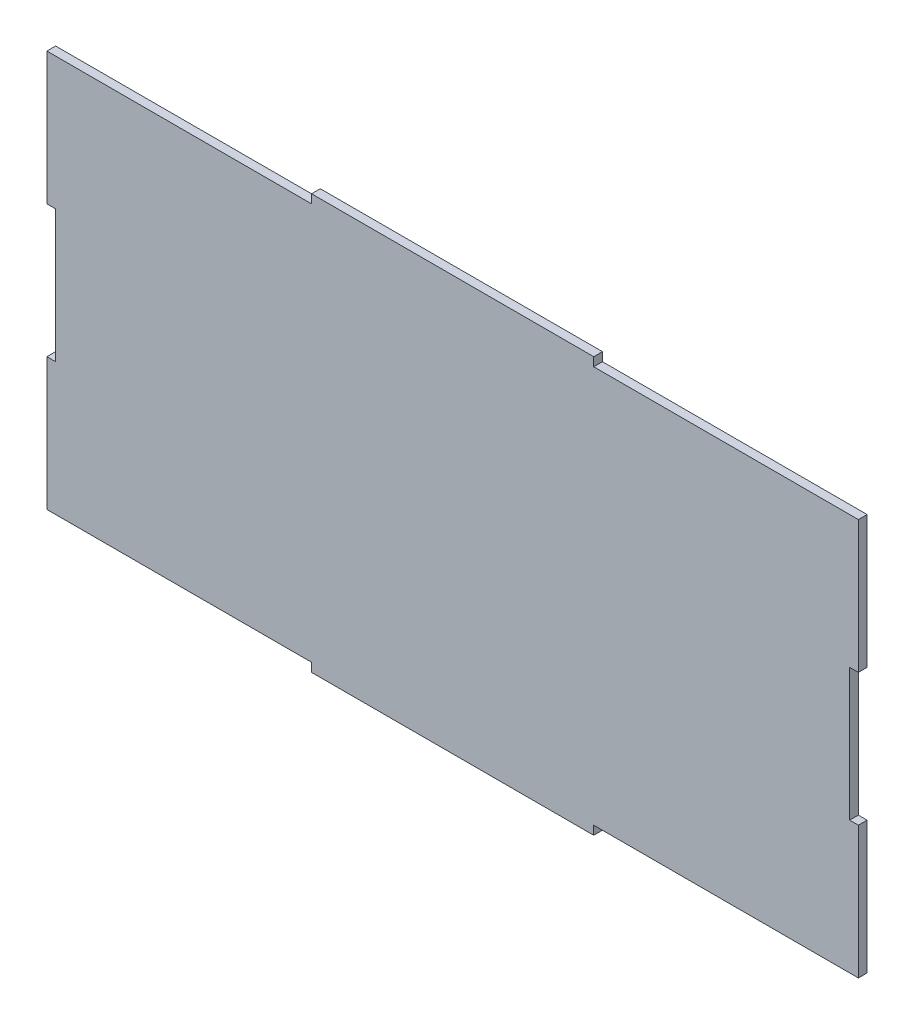
ISO-10303-21;
HEADER;
FILE_DESCRIPTION(('STEP AP214'),'2;1');
FILE_NAME('part.step','',(''),(''),'','','');
FILE_SCHEMA(('AUTOMOTIVE_DESIGN { 1 0 10303 214 1 1 1 1 }'));
ENDSEC;
DATA;
#1=APPLICATION_CONTEXT('core data for automotive mechanical design processes');
#2=APPLICATION_PROTOCOL_DEFINITION('international standard','automotive_design',2000,#1);
#3=PRODUCT_CONTEXT('',#1,'mechanical');
#4=PRODUCT('Part','Part','',(#3));
#5=PRODUCT_RELATED_PRODUCT_CATEGORY('part','',(#4));
#6=PRODUCT_DEFINITION_FORMATION('','',#4);
#7=PRODUCT_DEFINITION_CONTEXT('part definition',#1,'design');
#8=PRODUCT_DEFINITION('design','',#6,#7);
#9=PRODUCT_DEFINITION_SHAPE('','',#8);
#10=(LENGTH_UNIT() NAMED_UNIT(*) SI_UNIT(.MILLI.,.METRE.));
#11=(NAMED_UNIT(*) PLANE_ANGLE_UNIT() SI_UNIT($,.RADIAN.));
#12=(NAMED_UNIT(*) SI_UNIT($,.STERADIAN.) SOLID_ANGLE_UNIT());
#13=UNCERTAINTY_MEASURE_WITH_UNIT(LENGTH_MEASURE(1.E-05),#10,'distance_accuracy_value','');
#14=(GEOMETRIC_REPRESENTATION_CONTEXT(3) GLOBAL_UNCERTAINTY_ASSIGNED_CONTEXT((#13)) GLOBAL_UNIT_ASSIGNED_CONTEXT((#10,
#11,#12)) REPRESENTATION_CONTEXT('',''));
#15=CARTESIAN_POINT('',(0.,0.,0.));
#16=DIRECTION('',(0.,0.,1.));
#17=DIRECTION('',(1.,0.,0.));
#18=AXIS2_PLACEMENT_3D('',#15,#16,#17);
#19=CARTESIAN_POINT('',(-153.3,75.,3.3));
#20=DIRECTION('',(1.,0.,0.));
#21=DIRECTION('',(0.,0.,-1.));
#22=AXIS2_PLACEMENT_3D('',#19,#20,#21);
#23=PLANE('',#22);
#24=DIRECTION('',(0.,-1.,0.));
#25=VECTOR('',#24,1.);
#26=CARTESIAN_POINT('',(-153.3,75.,0.));
#27=LINE('',#26,#25);
#28=CARTESIAN_POINT('',(-153.3,75.,0.));
#29=VERTEX_POINT('',#28);
#30=CARTESIAN_POINT('',(-153.3,25.,0.));
#31=VERTEX_POINT('',#30);
#32=EDGE_CURVE('E212',#29,#31,#27,.T.);
#33=ORIENTED_EDGE('',*,*,#32,.T.);
#34=DIRECTION('',(0.,0.,-1.));
#35=VECTOR('',#34,1.);
#36=CARTESIAN_POINT('',(-153.3,25.,3.3));
#37=LINE('',#36,#35);
#38=CARTESIAN_POINT('',(-153.3,25.,3.3));
#39=VERTEX_POINT('',#38);
#40=EDGE_CURVE('E11',#39,#31,#37,.T.);
#41=ORIENTED_EDGE('',*,*,#40,.F.);
#42=DIRECTION('',(0.,-1.,0.));
#43=VECTOR('',#42,1.);
#44=CARTESIAN_POINT('',(-153.3,75.,3.3));
#45=LINE('',#44,#43);
#46=CARTESIAN_POINT('',(-153.3,75.,3.3));
#47=VERTEX_POINT('',#46);
#48=EDGE_CURVE('E270',#47,#39,#45,.T.);
#49=ORIENTED_EDGE('',*,*,#48,.F.);
#50=DIRECTION('',(0.,0.,-1.));
#51=VECTOR('',#50,1.);
#52=CARTESIAN_POINT('',(-153.3,75.,3.3));
#53=LINE('',#52,#51);
#54=EDGE_CURVE('E208',#47,#29,#53,.T.);
#55=ORIENTED_EDGE('',*,*,#54,.T.);
#56=EDGE_LOOP('',(#33,#41,#49,#55));
#57=FACE_BOUND('',#56,.T.);
#58=ADVANCED_FACE('F39',(#57),#23,.F.);
#59=CARTESIAN_POINT('',(-153.3,25.,3.3));
#60=DIRECTION('',(0.,1.,0.));
#61=DIRECTION('',(-1.,0.,0.));
#62=AXIS2_PLACEMENT_3D('',#59,#60,#61);
#63=PLANE('',#62);
#64=DIRECTION('',(1.,0.,0.));
#65=VECTOR('',#64,1.);
#66=CARTESIAN_POINT('',(-153.3,25.,0.));
#67=LINE('',#66,#65);
#68=CARTESIAN_POINT('',(-150.,25.,0.));
#69=VERTEX_POINT('',#68);
#70=EDGE_CURVE('E216',#31,#69,#67,.T.);
#71=ORIENTED_EDGE('',*,*,#70,.T.);
#72=DIRECTION('',(0.,0.,-1.));
#73=VECTOR('',#72,1.);
#74=CARTESIAN_POINT('',(-150.,25.,3.3));
#75=LINE('',#74,#73);
#76=CARTESIAN_POINT('',(-150.,25.,3.3));
#77=VERTEX_POINT('',#76);
#78=EDGE_CURVE('E48',#77,#69,#75,.T.);
#79=ORIENTED_EDGE('',*,*,#78,.F.);
#80=DIRECTION('',(1.,0.,0.));
#81=VECTOR('',#80,1.);
#82=CARTESIAN_POINT('',(-153.3,25.,3.3));
#83=LINE('',#82,#81);
#84=EDGE_CURVE('E135',#39,#77,#83,.T.);
#85=ORIENTED_EDGE('',*,*,#84,.F.);
#86=ORIENTED_EDGE('',*,*,#40,.T.);
#87=EDGE_LOOP('',(#71,#79,#85,#86));
#88=FACE_BOUND('',#87,.T.);
#89=ADVANCED_FACE('F420',(#88),#63,.F.);
#90=CARTESIAN_POINT('',(-150.,-25.,3.3));
#91=DIRECTION('',(1.,0.,0.));
#92=DIRECTION('',(0.,1.,0.));
#93=AXIS2_PLACEMENT_3D('',#90,#91,#92);
#94=PLANE('',#93);
#95=DIRECTION('',(0.,-1.,0.));
#96=VECTOR('',#95,1.);
#97=CARTESIAN_POINT('',(-150.,-25.,0.));
#98=LINE('',#97,#96);
#99=CARTESIAN_POINT('',(-150.,-25.,0.));
#100=VERTEX_POINT('',#99);
#101=EDGE_CURVE('E219',#69,#100,#98,.T.);
#102=ORIENTED_EDGE('',*,*,#101,.T.);
#103=DIRECTION('',(0.,0.,-1.));
#104=VECTOR('',#103,1.);
#105=CARTESIAN_POINT('',(-150.,-25.,3.3));
#106=LINE('',#105,#104);
#107=CARTESIAN_POINT('',(-150.,-25.,3.3));
#108=VERTEX_POINT('',#107);
#109=EDGE_CURVE('E329',#108,#100,#106,.T.);
#110=ORIENTED_EDGE('',*,*,#109,.F.);
#111=DIRECTION('',(0.,-1.,0.));
#112=VECTOR('',#111,1.);
#113=CARTESIAN_POINT('',(-150.,-25.,3.3));
#114=LINE('',#113,#112);
#115=EDGE_CURVE('E339',#77,#108,#114,.T.);
#116=ORIENTED_EDGE('',*,*,#115,.F.);
#117=ORIENTED_EDGE('',*,*,#78,.T.);
#118=EDGE_LOOP('',(#102,#110,#116,#117));
#119=FACE_BOUND('',#118,.T.);
#120=ADVANCED_FACE('F337',(#119),#94,.F.);
#121=CARTESIAN_POINT('',(-153.3,-25.,3.3));
#122=DIRECTION('',(0.,-1.,0.));
#123=DIRECTION('',(0.,0.,-1.));
#124=AXIS2_PLACEMENT_3D('',#121,#122,#123);
#125=PLANE('',#124);
#126=DIRECTION('',(-1.,0.,0.));
#127=VECTOR('',#126,1.);
#128=CARTESIAN_POINT('',(-153.3,-25.,0.));
#129=LINE('',#128,#127);
#130=CARTESIAN_POINT('',(-153.3,-25.,0.));
#131=VERTEX_POINT('',#130);
#132=EDGE_CURVE('E222',#100,#131,#129,.T.);
#133=ORIENTED_EDGE('',*,*,#132,.T.);
#134=DIRECTION('',(0.,0.,-1.));
#135=VECTOR('',#134,1.);
#136=CARTESIAN_POINT('',(-153.3,-25.,3.3));
#137=LINE('',#136,#135);
#138=CARTESIAN_POINT('',(-153.3,-25.,3.3));
#139=VERTEX_POINT('',#138);
#140=EDGE_CURVE('E325',#139,#131,#137,.T.);
#141=ORIENTED_EDGE('',*,*,#140,.F.);
#142=DIRECTION('',(-1.,0.,0.));
#143=VECTOR('',#142,1.);
#144=CARTESIAN_POINT('',(-153.3,-25.,3.3));
#145=LINE('',#144,#143);
#146=EDGE_CURVE('E358',#108,#139,#145,.T.);
#147=ORIENTED_EDGE('',*,*,#146,.F.);
#148=ORIENTED_EDGE('',*,*,#109,.T.);
#149=EDGE_LOOP('',(#133,#141,#147,#148));
#150=FACE_BOUND('',#149,.T.);
#151=ADVANCED_FACE('F348',(#150),#125,.F.);
#152=CARTESIAN_POINT('',(-153.3,-25.,3.3));
#153=DIRECTION('',(1.,0.,0.));
#154=DIRECTION('',(0.,0.,-1.));
#155=AXIS2_PLACEMENT_3D('',#152,#153,#154);
#156=PLANE('',#155);
#157=DIRECTION('',(0.,-1.,0.));
#158=VECTOR('',#157,1.);
#159=CARTESIAN_POINT('',(-153.3,-25.,0.));
#160=LINE('',#159,#158);
#161=CARTESIAN_POINT('',(-153.3,-75.,0.));
#162=VERTEX_POINT('',#161);
#163=EDGE_CURVE('E225',#131,#162,#160,.T.);
#164=ORIENTED_EDGE('',*,*,#163,.T.);
#165=DIRECTION('',(0.,0.,-1.));
#166=VECTOR('',#165,1.);
#167=CARTESIAN_POINT('',(-153.3,-75.,3.3));
#168=LINE('',#167,#166);
#169=CARTESIAN_POINT('',(-153.3,-75.,3.3));
#170=VERTEX_POINT('',#169);
#171=EDGE_CURVE('E321',#170,#162,#168,.T.);
#172=ORIENTED_EDGE('',*,*,#171,.F.);
#173=DIRECTION('',(0.,-1.,0.));
#174=VECTOR('',#173,1.);
#175=CARTESIAN_POINT('',(-153.3,-25.,3.3));
#176=LINE('',#175,#174);
#177=EDGE_CURVE('E354',#139,#170,#176,.T.);
#178=ORIENTED_EDGE('',*,*,#177,.F.);
#179=ORIENTED_EDGE('',*,*,#140,.T.);
#180=EDGE_LOOP('',(#164,#172,#178,#179));
#181=FACE_BOUND('',#180,.T.);
#182=ADVANCED_FACE('F352',(#181),#156,.F.);
#183=CARTESIAN_POINT('',(-153.3,-75.,3.3));
#184=DIRECTION('',(0.,1.,0.));
#185=DIRECTION('',(-1.,0.,0.));
#186=AXIS2_PLACEMENT_3D('',#183,#184,#185);
#187=PLANE('',#186);
#188=DIRECTION('',(1.,0.,0.));
#189=VECTOR('',#188,1.);
#190=CARTESIAN_POINT('',(-153.3,-75.,0.));
#191=LINE('',#190,#189);
#192=CARTESIAN_POINT('',(-53.3,-75.,0.));
#193=VERTEX_POINT('',#192);
#194=EDGE_CURVE('E228',#162,#193,#191,.T.);
#195=ORIENTED_EDGE('',*,*,#194,.T.);
#196=DIRECTION('',(0.,0.,-1.));
#197=VECTOR('',#196,1.);
#198=CARTESIAN_POINT('',(-53.3,-75.,3.3));
#199=LINE('',#198,#197);
#200=CARTESIAN_POINT('',(-53.3,-75.,3.3));
#201=VERTEX_POINT('',#200);
#202=EDGE_CURVE('E317',#201,#193,#199,.T.);
#203=ORIENTED_EDGE('',*,*,#202,.F.);
#204=DIRECTION('',(1.,0.,0.));
#205=VECTOR('',#204,1.);
#206=CARTESIAN_POINT('',(-153.3,-75.,3.3));
#207=LINE('',#206,#205);
#208=EDGE_CURVE('E357',#170,#201,#207,.T.);
#209=ORIENTED_EDGE('',*,*,#208,.F.);
#210=ORIENTED_EDGE('',*,*,#171,.T.);
#211=EDGE_LOOP('',(#195,#203,#209,#210));
#212=FACE_BOUND('',#211,.T.);
#213=ADVANCED_FACE('F433',(#212),#187,.F.);
#214=CARTESIAN_POINT('',(-53.3,-75.,3.3));
#215=DIRECTION('',(1.,0.,0.));
#216=DIRECTION('',(0.,1.,0.));
#217=AXIS2_PLACEMENT_3D('',#214,#215,#216);
#218=PLANE('',#217);
#219=DIRECTION('',(0.,-1.,0.));
#220=VECTOR('',#219,1.);
#221=CARTESIAN_POINT('',(-53.3,-75.,0.));
#222=LINE('',#221,#220);
#223=CARTESIAN_POINT('',(-53.3,-78.3,0.));
#224=VERTEX_POINT('',#223);
#225=EDGE_CURVE('E231',#193,#224,#222,.T.);
#226=ORIENTED_EDGE('',*,*,#225,.T.);
#227=DIRECTION('',(0.,0.,-1.));
#228=VECTOR('',#227,1.);
#229=CARTESIAN_POINT('',(-53.3,-78.3,3.3));
#230=LINE('',#229,#228);
#231=CARTESIAN_POINT('',(-53.3,-78.3,3.3));
#232=VERTEX_POINT('',#231);
#233=EDGE_CURVE('E313',#232,#224,#230,.T.);
#234=ORIENTED_EDGE('',*,*,#233,.F.);
#235=DIRECTION('',(0.,-1.,0.));
#236=VECTOR('',#235,1.);
#237=CARTESIAN_POINT('',(-53.3,-75.,3.3));
#238=LINE('',#237,#236);
#239=EDGE_CURVE('E362',#201,#232,#238,.T.);
#240=ORIENTED_EDGE('',*,*,#239,.F.);
#241=ORIENTED_EDGE('',*,*,#202,.T.);
#242=EDGE_LOOP('',(#226,#234,#240,#241));
#243=FACE_BOUND('',#242,.T.);
#244=ADVANCED_FACE('F436',(#243),#218,.F.);
#245=CARTESIAN_POINT('',(53.3,-78.3,3.3));
#246=DIRECTION('',(0.,1.,0.));
#247=DIRECTION('',(-1.,0.,0.));
#248=AXIS2_PLACEMENT_3D('',#245,#246,#247);
#249=PLANE('',#248);
#250=DIRECTION('',(1.,0.,0.));
#251=VECTOR('',#250,1.);
#252=CARTESIAN_POINT('',(53.3,-78.3,0.));
#253=LINE('',#252,#251);
#254=CARTESIAN_POINT('',(53.3,-78.3,0.));
#255=VERTEX_POINT('',#254);
#256=EDGE_CURVE('E234',#224,#255,#253,.T.);
#257=ORIENTED_EDGE('',*,*,#256,.T.);
#258=DIRECTION('',(0.,0.,-1.));
#259=VECTOR('',#258,1.);
#260=CARTESIAN_POINT('',(53.3,-78.3,3.3));
#261=LINE('',#260,#259);
#262=CARTESIAN_POINT('',(53.3,-78.3,3.3));
#263=VERTEX_POINT('',#262);
#264=EDGE_CURVE('E309',#263,#255,#261,.T.);
#265=ORIENTED_EDGE('',*,*,#264,.F.);
#266=DIRECTION('',(1.,0.,0.));
#267=VECTOR('',#266,1.);
#268=CARTESIAN_POINT('',(53.3,-78.3,3.3));
#269=LINE('',#268,#267);
#270=EDGE_CURVE('E369',#232,#263,#269,.T.);
#271=ORIENTED_EDGE('',*,*,#270,.F.);
#272=ORIENTED_EDGE('',*,*,#233,.T.);
#273=EDGE_LOOP('',(#257,#265,#271,#272));
#274=FACE_BOUND('',#273,.T.);
#275=ADVANCED_FACE('F440',(#274),#249,.F.);
#276=CARTESIAN_POINT('',(53.3,-75.,3.3));
#277=DIRECTION('',(-1.,0.,0.));
#278=DIRECTION('',(0.,-1.,0.));
#279=AXIS2_PLACEMENT_3D('',#276,#277,#278);
#280=PLANE('',#279);
#281=DIRECTION('',(0.,1.,0.));
#282=VECTOR('',#281,1.);
#283=CARTESIAN_POINT('',(53.3,-75.,0.));
#284=LINE('',#283,#282);
#285=CARTESIAN_POINT('',(53.3,-75.,0.));
#286=VERTEX_POINT('',#285);
#287=EDGE_CURVE('E237',#255,#286,#284,.T.);
#288=ORIENTED_EDGE('',*,*,#287,.T.);
#289=DIRECTION('',(0.,0.,-1.));
#290=VECTOR('',#289,1.);
#291=CARTESIAN_POINT('',(53.3,-75.,3.3));
#292=LINE('',#291,#290);
#293=CARTESIAN_POINT('',(53.3,-75.,3.3));
#294=VERTEX_POINT('',#293);
#295=EDGE_CURVE('E305',#294,#286,#292,.T.);
#296=ORIENTED_EDGE('',*,*,#295,.F.);
#297=DIRECTION('',(0.,1.,0.));
#298=VECTOR('',#297,1.);
#299=CARTESIAN_POINT('',(53.3,-75.,3.3));
#300=LINE('',#299,#298);
#301=EDGE_CURVE('E372',#263,#294,#300,.T.);
#302=ORIENTED_EDGE('',*,*,#301,.F.);
#303=ORIENTED_EDGE('',*,*,#264,.T.);
#304=EDGE_LOOP('',(#288,#296,#302,#303));
#305=FACE_BOUND('',#304,.T.);
#306=ADVANCED_FACE('F444',(#305),#280,.F.);
#307=CARTESIAN_POINT('',(53.3,-75.,3.3));
#308=DIRECTION('',(0.,1.,0.));
#309=DIRECTION('',(-1.,0.,0.));
#310=AXIS2_PLACEMENT_3D('',#307,#308,#309);
#311=PLANE('',#310);
#312=DIRECTION('',(1.,0.,0.));
#313=VECTOR('',#312,1.);
#314=CARTESIAN_POINT('',(53.3,-75.,0.));
#315=LINE('',#314,#313);
#316=CARTESIAN_POINT('',(153.3,-74.9999999999999,0.));
#317=VERTEX_POINT('',#316);
#318=EDGE_CURVE('E240',#286,#317,#315,.T.);
#319=ORIENTED_EDGE('',*,*,#318,.T.);
#320=DIRECTION('',(0.,0.,-1.));
#321=VECTOR('',#320,1.);
#322=CARTESIAN_POINT('',(153.3,-74.9999999999999,3.3));
#323=LINE('',#322,#321);
#324=CARTESIAN_POINT('',(153.3,-74.9999999999999,3.3));
#325=VERTEX_POINT('',#324);
#326=EDGE_CURVE('E301',#325,#317,#323,.T.);
#327=ORIENTED_EDGE('',*,*,#326,.F.);
#328=DIRECTION('',(1.,0.,0.));
#329=VECTOR('',#328,1.);
#330=CARTESIAN_POINT('',(53.3,-75.,3.3));
#331=LINE('',#330,#329);
#332=EDGE_CURVE('E375',#294,#325,#331,.T.);
#333=ORIENTED_EDGE('',*,*,#332,.F.);
#334=ORIENTED_EDGE('',*,*,#295,.T.);
#335=EDGE_LOOP('',(#319,#327,#333,#334));
#336=FACE_BOUND('',#335,.T.);
#337=ADVANCED_FACE('F448',(#336),#311,.F.);
#338=CARTESIAN_POINT('',(153.3,-24.9999999999999,3.3));
#339=DIRECTION('',(-1.,0.,0.));
#340=DIRECTION('',(0.,-1.,0.));
#341=AXIS2_PLACEMENT_3D('',#338,#339,#340);
#342=PLANE('',#341);
#343=DIRECTION('',(0.,1.,0.));
#344=VECTOR('',#343,1.);
#345=CARTESIAN_POINT('',(153.3,-24.9999999999999,0.));
#346=LINE('',#345,#344);
#347=CARTESIAN_POINT('',(153.3,-24.9999999999999,0.));
#348=VERTEX_POINT('',#347);
#349=EDGE_CURVE('E243',#317,#348,#346,.T.);
#350=ORIENTED_EDGE('',*,*,#349,.T.);
#351=DIRECTION('',(0.,0.,-1.));
#352=VECTOR('',#351,1.);
#353=CARTESIAN_POINT('',(153.3,-24.9999999999999,3.3));
#354=LINE('',#353,#352);
#355=CARTESIAN_POINT('',(153.3,-24.9999999999999,3.3));
#356=VERTEX_POINT('',#355);
#357=EDGE_CURVE('E297',#356,#348,#354,.T.);
#358=ORIENTED_EDGE('',*,*,#357,.F.);
#359=DIRECTION('',(0.,1.,0.));
#360=VECTOR('',#359,1.);
#361=CARTESIAN_POINT('',(153.3,-24.9999999999999,3.3));
#362=LINE('',#361,#360);
#363=EDGE_CURVE('E378',#325,#356,#362,.T.);
#364=ORIENTED_EDGE('',*,*,#363,.F.);
#365=ORIENTED_EDGE('',*,*,#326,.T.);
#366=EDGE_LOOP('',(#350,#358,#364,#365));
#367=FACE_BOUND('',#366,.T.);
#368=ADVANCED_FACE('F452',(#367),#342,.F.);
#369=CARTESIAN_POINT('',(153.3,-24.9999999999999,3.3));
#370=DIRECTION('',(0.,-1.,0.));
#371=DIRECTION('',(0.,0.,-1.));
#372=AXIS2_PLACEMENT_3D('',#369,#370,#371);
#373=PLANE('',#372);
#374=DIRECTION('',(-1.,0.,0.));
#375=VECTOR('',#374,1.);
#376=CARTESIAN_POINT('',(153.3,-24.9999999999999,0.));
#377=LINE('',#376,#375);
#378=CARTESIAN_POINT('',(150.,-24.9999999999999,0.));
#379=VERTEX_POINT('',#378);
#380=EDGE_CURVE('E246',#348,#379,#377,.T.);
#381=ORIENTED_EDGE('',*,*,#380,.T.);
#382=DIRECTION('',(0.,0.,-1.));
#383=VECTOR('',#382,1.);
#384=CARTESIAN_POINT('',(150.,-24.9999999999999,3.3));
#385=LINE('',#384,#383);
#386=CARTESIAN_POINT('',(150.,-24.9999999999999,3.3));
#387=VERTEX_POINT('',#386);
#388=EDGE_CURVE('E293',#387,#379,#385,.T.);
#389=ORIENTED_EDGE('',*,*,#388,.F.);
#390=DIRECTION('',(-1.,0.,0.));
#391=VECTOR('',#390,1.);
#392=CARTESIAN_POINT('',(153.3,-24.9999999999999,3.3));
#393=LINE('',#392,#391);
#394=EDGE_CURVE('E381',#356,#387,#393,.T.);
#395=ORIENTED_EDGE('',*,*,#394,.F.);
#396=ORIENTED_EDGE('',*,*,#357,.T.);
#397=EDGE_LOOP('',(#381,#389,#395,#396));
#398=FACE_BOUND('',#397,.T.);
#399=ADVANCED_FACE('F456',(#398),#373,.F.);
#400=CARTESIAN_POINT('',(150.,24.9999999999999,3.3));
#401=DIRECTION('',(-1.,0.,0.));
#402=DIRECTION('',(0.,0.,1.));
#403=AXIS2_PLACEMENT_3D('',#400,#401,#402);
#404=PLANE('',#403);
#405=DIRECTION('',(0.,1.,0.));
#406=VECTOR('',#405,1.);
#407=CARTESIAN_POINT('',(150.,24.9999999999999,0.));
#408=LINE('',#407,#406);
#409=CARTESIAN_POINT('',(150.,24.9999999999999,0.));
#410=VERTEX_POINT('',#409);
#411=EDGE_CURVE('E249',#379,#410,#408,.T.);
#412=ORIENTED_EDGE('',*,*,#411,.T.);
#413=DIRECTION('',(0.,0.,-1.));
#414=VECTOR('',#413,1.);
#415=CARTESIAN_POINT('',(150.,24.9999999999999,3.3));
#416=LINE('',#415,#414);
#417=CARTESIAN_POINT('',(150.,24.9999999999999,3.3));
#418=VERTEX_POINT('',#417);
#419=EDGE_CURVE('E289',#418,#410,#416,.T.);
#420=ORIENTED_EDGE('',*,*,#419,.F.);
#421=DIRECTION('',(0.,1.,0.));
#422=VECTOR('',#421,1.);
#423=CARTESIAN_POINT('',(150.,24.9999999999999,3.3));
#424=LINE('',#423,#422);
#425=EDGE_CURVE('E384',#387,#418,#424,.T.);
#426=ORIENTED_EDGE('',*,*,#425,.F.);
#427=ORIENTED_EDGE('',*,*,#388,.T.);
#428=EDGE_LOOP('',(#412,#420,#426,#427));
#429=FACE_BOUND('',#428,.T.);
#430=ADVANCED_FACE('F460',(#429),#404,.F.);
#431=CARTESIAN_POINT('',(153.3,24.9999999999999,3.3));
#432=DIRECTION('',(0.,1.,0.));
#433=DIRECTION('',(0.,0.,1.));
#434=AXIS2_PLACEMENT_3D('',#431,#432,#433);
#435=PLANE('',#434);
#436=DIRECTION('',(1.,0.,0.));
#437=VECTOR('',#436,1.);
#438=CARTESIAN_POINT('',(153.3,24.9999999999999,0.));
#439=LINE('',#438,#437);
#440=CARTESIAN_POINT('',(153.3,24.9999999999999,0.));
#441=VERTEX_POINT('',#440);
#442=EDGE_CURVE('E252',#410,#441,#439,.T.);
#443=ORIENTED_EDGE('',*,*,#442,.T.);
#444=DIRECTION('',(0.,0.,-1.));
#445=VECTOR('',#444,1.);
#446=CARTESIAN_POINT('',(153.3,24.9999999999999,3.3));
#447=LINE('',#446,#445);
#448=CARTESIAN_POINT('',(153.3,24.9999999999999,3.3));
#449=VERTEX_POINT('',#448);
#450=EDGE_CURVE('E285',#449,#441,#447,.T.);
#451=ORIENTED_EDGE('',*,*,#450,.F.);
#452=DIRECTION('',(1.,0.,0.));
#453=VECTOR('',#452,1.);
#454=CARTESIAN_POINT('',(153.3,24.9999999999999,3.3));
#455=LINE('',#454,#453);
#456=EDGE_CURVE('E387',#418,#449,#455,.T.);
#457=ORIENTED_EDGE('',*,*,#456,.F.);
#458=ORIENTED_EDGE('',*,*,#419,.T.);
#459=EDGE_LOOP('',(#443,#451,#457,#458));
#460=FACE_BOUND('',#459,.T.);
#461=ADVANCED_FACE('F464',(#460),#435,.F.);
#462=CARTESIAN_POINT('',(153.3,74.9999999999999,3.3));
#463=DIRECTION('',(-1.,0.,0.));
#464=DIRECTION('',(0.,-1.,0.));
#465=AXIS2_PLACEMENT_3D('',#462,#463,#464);
#466=PLANE('',#465);
#467=DIRECTION('',(0.,1.,0.));
#468=VECTOR('',#467,1.);
#469=CARTESIAN_POINT('',(153.3,74.9999999999999,0.));
#470=LINE('',#469,#468);
#471=CARTESIAN_POINT('',(153.3,74.9999999999999,0.));
#472=VERTEX_POINT('',#471);
#473=EDGE_CURVE('E255',#441,#472,#470,.T.);
#474=ORIENTED_EDGE('',*,*,#473,.T.);
#475=DIRECTION('',(0.,0.,-1.));
#476=VECTOR('',#475,1.);
#477=CARTESIAN_POINT('',(153.3,74.9999999999999,3.3));
#478=LINE('',#477,#476);
#479=CARTESIAN_POINT('',(153.3,74.9999999999999,3.3));
#480=VERTEX_POINT('',#479);
#481=EDGE_CURVE('E281',#480,#472,#478,.T.);
#482=ORIENTED_EDGE('',*,*,#481,.F.);
#483=DIRECTION('',(0.,1.,0.));
#484=VECTOR('',#483,1.);
#485=CARTESIAN_POINT('',(153.3,74.9999999999999,3.3));
#486=LINE('',#485,#484);
#487=EDGE_CURVE('E390',#449,#480,#486,.T.);
#488=ORIENTED_EDGE('',*,*,#487,.F.);
#489=ORIENTED_EDGE('',*,*,#450,.T.);
#490=EDGE_LOOP('',(#474,#482,#488,#489));
#491=FACE_BOUND('',#490,.T.);
#492=ADVANCED_FACE('F468',(#491),#466,.F.);
#493=CARTESIAN_POINT('',(53.3,75.,3.3));
#494=DIRECTION('',(0.,-1.,0.));
#495=DIRECTION('',(1.,0.,0.));
#496=AXIS2_PLACEMENT_3D('',#493,#494,#495);
#497=PLANE('',#496);
#498=DIRECTION('',(-1.,0.,0.));
#499=VECTOR('',#498,1.);
#500=CARTESIAN_POINT('',(53.3,75.,0.));
#501=LINE('',#500,#499);
#502=CARTESIAN_POINT('',(53.3,75.,0.));
#503=VERTEX_POINT('',#502);
#504=EDGE_CURVE('E258',#472,#503,#501,.T.);
#505=ORIENTED_EDGE('',*,*,#504,.T.);
#506=DIRECTION('',(0.,0.,-1.));
#507=VECTOR('',#506,1.);
#508=CARTESIAN_POINT('',(53.3,75.,3.3));
#509=LINE('',#508,#507);
#510=CARTESIAN_POINT('',(53.3,75.,3.3));
#511=VERTEX_POINT('',#510);
#512=EDGE_CURVE('E277',#511,#503,#509,.T.);
#513=ORIENTED_EDGE('',*,*,#512,.F.);
#514=DIRECTION('',(-1.,0.,0.));
#515=VECTOR('',#514,1.);
#516=CARTESIAN_POINT('',(53.3,75.,3.3));
#517=LINE('',#516,#515);
#518=EDGE_CURVE('E393',#480,#511,#517,.T.);
#519=ORIENTED_EDGE('',*,*,#518,.F.);
#520=ORIENTED_EDGE('',*,*,#481,.T.);
#521=EDGE_LOOP('',(#505,#513,#519,#520));
#522=FACE_BOUND('',#521,.T.);
#523=ADVANCED_FACE('F401',(#522),#497,.F.);
#524=CARTESIAN_POINT('',(53.3,75.,3.3));
#525=DIRECTION('',(-1.,0.,0.));
#526=DIRECTION('',(0.,-1.,0.));
#527=AXIS2_PLACEMENT_3D('',#524,#525,#526);
#528=PLANE('',#527);
#529=DIRECTION('',(0.,1.,0.));
#530=VECTOR('',#529,1.);
#531=CARTESIAN_POINT('',(53.3,75.,0.));
#532=LINE('',#531,#530);
#533=CARTESIAN_POINT('',(53.3,78.3,0.));
#534=VERTEX_POINT('',#533);
#535=EDGE_CURVE('E261',#503,#534,#532,.T.);
#536=ORIENTED_EDGE('',*,*,#535,.T.);
#537=DIRECTION('',(0.,0.,-1.));
#538=VECTOR('',#537,1.);
#539=CARTESIAN_POINT('',(53.3,78.3,3.3));
#540=LINE('',#539,#538);
#541=CARTESIAN_POINT('',(53.3,78.3,3.3));
#542=VERTEX_POINT('',#541);
#543=EDGE_CURVE('E201',#542,#534,#540,.T.);
#544=ORIENTED_EDGE('',*,*,#543,.F.);
#545=DIRECTION('',(0.,1.,0.));
#546=VECTOR('',#545,1.);
#547=CARTESIAN_POINT('',(53.3,75.,3.3));
#548=LINE('',#547,#546);
#549=EDGE_CURVE('E190',#511,#542,#548,.T.);
#550=ORIENTED_EDGE('',*,*,#549,.F.);
#551=ORIENTED_EDGE('',*,*,#512,.T.);
#552=EDGE_LOOP('',(#536,#544,#550,#551));
#553=FACE_BOUND('',#552,.T.);
#554=ADVANCED_FACE('F405',(#553),#528,.F.);
#555=CARTESIAN_POINT('',(-53.3,78.3,3.3));
#556=DIRECTION('',(0.,-1.,0.));
#557=DIRECTION('',(1.,0.,0.));
#558=AXIS2_PLACEMENT_3D('',#555,#556,#557);
#559=PLANE('',#558);
#560=DIRECTION('',(-1.,0.,0.));
#561=VECTOR('',#560,1.);
#562=CARTESIAN_POINT('',(-53.3,78.3,0.));
#563=LINE('',#562,#561);
#564=CARTESIAN_POINT('',(-53.3,78.3,0.));
#565=VERTEX_POINT('',#564);
#566=EDGE_CURVE('E199',#534,#565,#563,.T.);
#567=ORIENTED_EDGE('',*,*,#566,.T.);
#568=DIRECTION('',(0.,0.,-1.));
#569=VECTOR('',#568,1.);
#570=CARTESIAN_POINT('',(-53.3,78.3,3.3));
#571=LINE('',#570,#569);
#572=CARTESIAN_POINT('',(-53.3,78.3,3.3));
#573=VERTEX_POINT('',#572);
#574=EDGE_CURVE('E196',#573,#565,#571,.T.);
#575=ORIENTED_EDGE('',*,*,#574,.F.);
#576=DIRECTION('',(-1.,0.,0.));
#577=VECTOR('',#576,1.);
#578=CARTESIAN_POINT('',(-53.3,78.3,3.3));
#579=LINE('',#578,#577);
#580=EDGE_CURVE('E184',#542,#573,#579,.T.);
#581=ORIENTED_EDGE('',*,*,#580,.F.);
#582=ORIENTED_EDGE('',*,*,#543,.T.);
#583=EDGE_LOOP('',(#567,#575,#581,#582));
#584=FACE_BOUND('',#583,.T.);
#585=ADVANCED_FACE('F197',(#584),#559,.F.);
#586=CARTESIAN_POINT('',(-53.3,75.,3.3));
#587=DIRECTION('',(1.,0.,0.));
#588=DIRECTION('',(0.,1.,0.));
#589=AXIS2_PLACEMENT_3D('',#586,#587,#588);
#590=PLANE('',#589);
#591=DIRECTION('',(0.,-1.,0.));
#592=VECTOR('',#591,1.);
#593=CARTESIAN_POINT('',(-53.3,75.,0.));
#594=LINE('',#593,#592);
#595=CARTESIAN_POINT('',(-53.3,75.,0.));
#596=VERTEX_POINT('',#595);
#597=EDGE_CURVE('E121',#565,#596,#594,.T.);
#598=ORIENTED_EDGE('',*,*,#597,.T.);
#599=DIRECTION('',(0.,0.,-1.));
#600=VECTOR('',#599,1.);
#601=CARTESIAN_POINT('',(-53.3,75.,3.3));
#602=LINE('',#601,#600);
#603=CARTESIAN_POINT('',(-53.3,75.,3.3));
#604=VERTEX_POINT('',#603);
#605=EDGE_CURVE('E202',#604,#596,#602,.T.);
#606=ORIENTED_EDGE('',*,*,#605,.F.);
#607=DIRECTION('',(0.,-1.,0.));
#608=VECTOR('',#607,1.);
#609=CARTESIAN_POINT('',(-53.3,75.,3.3));
#610=LINE('',#609,#608);
#611=EDGE_CURVE('E188',#573,#604,#610,.T.);
#612=ORIENTED_EDGE('',*,*,#611,.F.);
#613=ORIENTED_EDGE('',*,*,#574,.T.);
#614=EDGE_LOOP('',(#598,#606,#612,#613));
#615=FACE_BOUND('',#614,.T.);
#616=ADVANCED_FACE('F204',(#615),#590,.F.);
#617=CARTESIAN_POINT('',(-153.3,75.,3.3));
#618=DIRECTION('',(0.,-1.,0.));
#619=DIRECTION('',(1.,0.,0.));
#620=AXIS2_PLACEMENT_3D('',#617,#618,#619);
#621=PLANE('',#620);
#622=DIRECTION('',(-1.,0.,0.));
#623=VECTOR('',#622,1.);
#624=CARTESIAN_POINT('',(-153.3,75.,0.));
#625=LINE('',#624,#623);
#626=EDGE_CURVE('E127',#596,#29,#625,.T.);
#627=ORIENTED_EDGE('',*,*,#626,.T.);
#628=ORIENTED_EDGE('',*,*,#54,.F.);
#629=DIRECTION('',(-1.,0.,0.));
#630=VECTOR('',#629,1.);
#631=CARTESIAN_POINT('',(-153.3,75.,3.3));
#632=LINE('',#631,#630);
#633=EDGE_CURVE('E56',#604,#47,#632,.T.);
#634=ORIENTED_EDGE('',*,*,#633,.F.);
#635=ORIENTED_EDGE('',*,*,#605,.T.);
#636=EDGE_LOOP('',(#627,#628,#634,#635));
#637=FACE_BOUND('',#636,.T.);
#638=ADVANCED_FACE('F409',(#637),#621,.F.);
#639=CARTESIAN_POINT('',(0.,0.,3.3));
#640=DIRECTION('',(0.,0.,1.));
#641=DIRECTION('',(1.,0.,0.));
#642=AXIS2_PLACEMENT_3D('',#639,#640,#641);
#643=PLANE('',#642);
#644=ORIENTED_EDGE('',*,*,#48,.T.);
#645=ORIENTED_EDGE('',*,*,#84,.T.);
#646=ORIENTED_EDGE('',*,*,#115,.T.);
#647=ORIENTED_EDGE('',*,*,#146,.T.);
#648=ORIENTED_EDGE('',*,*,#177,.T.);
#649=ORIENTED_EDGE('',*,*,#208,.T.);
#650=ORIENTED_EDGE('',*,*,#239,.T.);
#651=ORIENTED_EDGE('',*,*,#270,.T.);
#652=ORIENTED_EDGE('',*,*,#301,.T.);
#653=ORIENTED_EDGE('',*,*,#332,.T.);
#654=ORIENTED_EDGE('',*,*,#363,.T.);
#655=ORIENTED_EDGE('',*,*,#394,.T.);
#656=ORIENTED_EDGE('',*,*,#425,.T.);
#657=ORIENTED_EDGE('',*,*,#456,.T.);
#658=ORIENTED_EDGE('',*,*,#487,.T.);
#659=ORIENTED_EDGE('',*,*,#518,.T.);
#660=ORIENTED_EDGE('',*,*,#549,.T.);
#661=ORIENTED_EDGE('',*,*,#580,.T.);
#662=ORIENTED_EDGE('',*,*,#611,.T.);
#663=ORIENTED_EDGE('',*,*,#633,.T.);
#664=EDGE_LOOP('',(#644,#645,#646,#647,#648,#649,#650,#651,#652,#653,#654,#655,#656,#657,#658,
#659,#660,#661,#662,#663));
#665=FACE_BOUND('',#664,.T.);
#666=ADVANCED_FACE('F186',(#665),#643,.T.);
#667=CARTESIAN_POINT('',(0.,0.,0.));
#668=DIRECTION('',(0.,0.,1.));
#669=DIRECTION('',(1.,0.,0.));
#670=AXIS2_PLACEMENT_3D('',#667,#668,#669);
#671=PLANE('',#670);
#672=ORIENTED_EDGE('',*,*,#32,.F.);
#673=ORIENTED_EDGE('',*,*,#626,.F.);
#674=ORIENTED_EDGE('',*,*,#597,.F.);
#675=ORIENTED_EDGE('',*,*,#566,.F.);
#676=ORIENTED_EDGE('',*,*,#535,.F.);
#677=ORIENTED_EDGE('',*,*,#504,.F.);
#678=ORIENTED_EDGE('',*,*,#473,.F.);
#679=ORIENTED_EDGE('',*,*,#442,.F.);
#680=ORIENTED_EDGE('',*,*,#411,.F.);
#681=ORIENTED_EDGE('',*,*,#380,.F.);
#682=ORIENTED_EDGE('',*,*,#349,.F.);
#683=ORIENTED_EDGE('',*,*,#318,.F.);
#684=ORIENTED_EDGE('',*,*,#287,.F.);
#685=ORIENTED_EDGE('',*,*,#256,.F.);
#686=ORIENTED_EDGE('',*,*,#225,.F.);
#687=ORIENTED_EDGE('',*,*,#194,.F.);
#688=ORIENTED_EDGE('',*,*,#163,.F.);
#689=ORIENTED_EDGE('',*,*,#132,.F.);
#690=ORIENTED_EDGE('',*,*,#101,.F.);
#691=ORIENTED_EDGE('',*,*,#70,.F.);
#692=EDGE_LOOP('',(#672,#673,#674,#675,#676,#677,#678,#679,#680,#681,#682,#683,#684,#685,#686,
#687,#688,#689,#690,#691));
#693=FACE_BOUND('',#692,.T.);
#694=ADVANCED_FACE('F343',(#693),#671,.F.);
#695=CLOSED_SHELL('',(#58,#89,#120,#151,#182,#213,#244,#275,#306,#337,#368,#399,#430,#461,#492,
#523,#554,#585,#616,#638,#666,#694));
#696=MANIFOLD_SOLID_BREP('B2',#695);
#697=ADVANCED_BREP_SHAPE_REPRESENTATION('',(#18,#696),#14);
#698=SHAPE_DEFINITION_REPRESENTATION(#9,#697);
ENDSEC;
END-ISO-10303-21;
